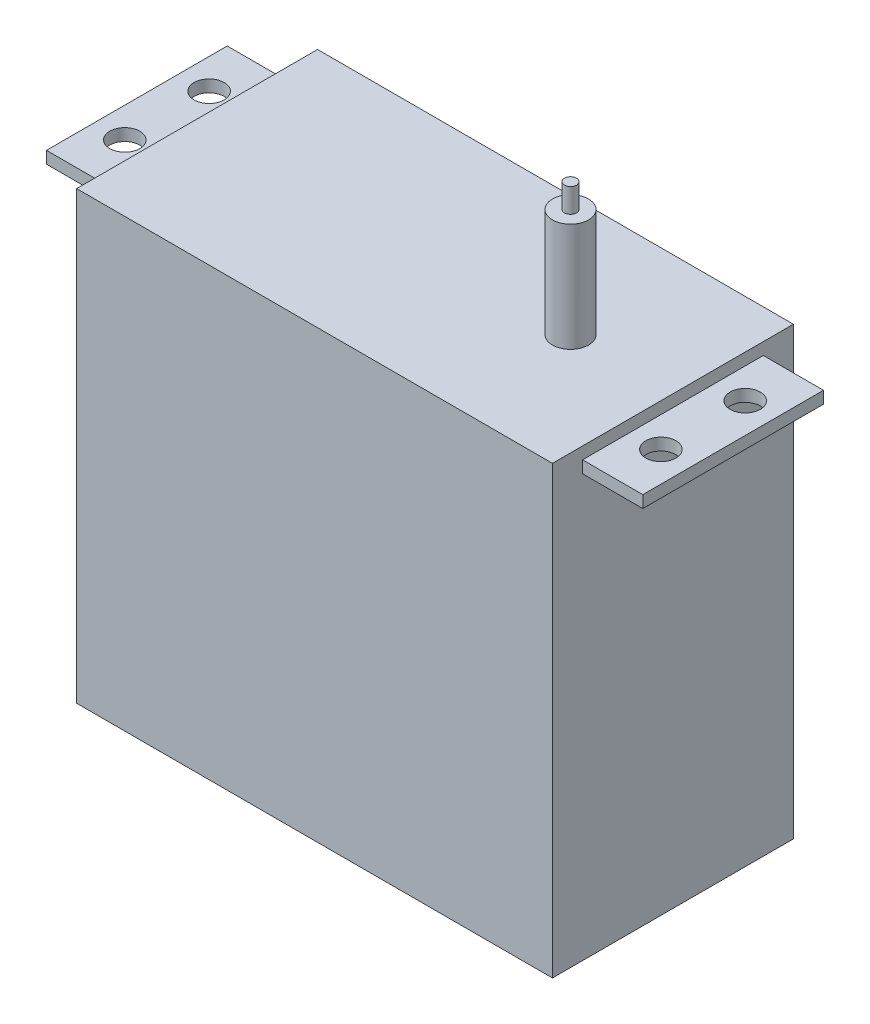
ISO-10303-21;
HEADER;
FILE_DESCRIPTION(('STEP AP214'),'2;1');
FILE_NAME('part.step','',(''),(''),'','','');
FILE_SCHEMA(('AUTOMOTIVE_DESIGN { 1 0 10303 214 1 1 1 1 }'));
ENDSEC;
DATA;
#1=APPLICATION_CONTEXT('core data for automotive mechanical design processes');
#2=APPLICATION_PROTOCOL_DEFINITION('international standard','automotive_design',2000,#1);
#3=PRODUCT_CONTEXT('',#1,'mechanical');
#4=PRODUCT('Part','Part','',(#3));
#5=PRODUCT_RELATED_PRODUCT_CATEGORY('part','',(#4));
#6=PRODUCT_DEFINITION_FORMATION('','',#4);
#7=PRODUCT_DEFINITION_CONTEXT('part definition',#1,'design');
#8=PRODUCT_DEFINITION('design','',#6,#7);
#9=PRODUCT_DEFINITION_SHAPE('','',#8);
#10=(LENGTH_UNIT() NAMED_UNIT(*) SI_UNIT(.MILLI.,.METRE.));
#11=(NAMED_UNIT(*) PLANE_ANGLE_UNIT() SI_UNIT($,.RADIAN.));
#12=(NAMED_UNIT(*) SI_UNIT($,.STERADIAN.) SOLID_ANGLE_UNIT());
#13=UNCERTAINTY_MEASURE_WITH_UNIT(LENGTH_MEASURE(1.E-05),#10,'distance_accuracy_value','');
#14=(GEOMETRIC_REPRESENTATION_CONTEXT(3) GLOBAL_UNCERTAINTY_ASSIGNED_CONTEXT((#13)) GLOBAL_UNIT_ASSIGNED_CONTEXT((#10,
#11,#12)) REPRESENTATION_CONTEXT('',''));
#15=CARTESIAN_POINT('',(0.,0.,0.));
#16=DIRECTION('',(0.,0.,1.));
#17=DIRECTION('',(1.,0.,0.));
#18=AXIS2_PLACEMENT_3D('',#15,#16,#17);
#19=CARTESIAN_POINT('',(0.,37.,0.));
#20=DIRECTION('',(1.,0.,0.));
#21=DIRECTION('',(0.,0.,-1.));
#22=AXIS2_PLACEMENT_3D('',#19,#20,#21);
#23=PLANE('',#22);
#24=DIRECTION('',(0.,0.,1.));
#25=VECTOR('',#24,1.);
#26=CARTESIAN_POINT('',(0.,0.,0.));
#27=LINE('',#26,#25);
#28=CARTESIAN_POINT('',(0.,0.,-20.));
#29=VERTEX_POINT('',#28);
#30=CARTESIAN_POINT('',(0.,0.,0.));
#31=VERTEX_POINT('',#30);
#32=EDGE_CURVE('E183',#29,#31,#27,.T.);
#33=ORIENTED_EDGE('',*,*,#32,.T.);
#34=DIRECTION('',(0.,-1.,0.));
#35=VECTOR('',#34,1.);
#36=CARTESIAN_POINT('',(0.,37.,0.));
#37=LINE('',#36,#35);
#38=CARTESIAN_POINT('',(0.,37.,0.));
#39=VERTEX_POINT('',#38);
#40=EDGE_CURVE('E40',#39,#31,#37,.T.);
#41=ORIENTED_EDGE('',*,*,#40,.F.);
#42=DIRECTION('',(0.,0.,1.));
#43=VECTOR('',#42,1.);
#44=CARTESIAN_POINT('',(0.,37.,0.));
#45=LINE('',#44,#43);
#46=CARTESIAN_POINT('',(0.,37.,-20.));
#47=VERTEX_POINT('',#46);
#48=EDGE_CURVE('E184',#47,#39,#45,.T.);
#49=ORIENTED_EDGE('',*,*,#48,.F.);
#50=DIRECTION('',(0.,-1.,0.));
#51=VECTOR('',#50,1.);
#52=CARTESIAN_POINT('',(0.,37.,-20.));
#53=LINE('',#52,#51);
#54=EDGE_CURVE('E194',#47,#29,#53,.T.);
#55=ORIENTED_EDGE('',*,*,#54,.T.);
#56=EDGE_LOOP('',(#33,#41,#49,#55));
#57=FACE_BOUND('',#56,.T.);
#58=DIRECTION('',(0.,-1.,0.));
#59=VECTOR('',#58,1.);
#60=CARTESIAN_POINT('',(0.,35.,-17.5));
#61=LINE('',#60,#59);
#62=CARTESIAN_POINT('',(0.,36.,-17.5));
#63=VERTEX_POINT('',#62);
#64=CARTESIAN_POINT('',(0.,35.,-17.5));
#65=VERTEX_POINT('',#64);
#66=EDGE_CURVE('E141',#63,#65,#61,.T.);
#67=ORIENTED_EDGE('',*,*,#66,.F.);
#68=DIRECTION('',(0.,0.,-1.));
#69=VECTOR('',#68,1.);
#70=CARTESIAN_POINT('',(0.,36.,-17.5));
#71=LINE('',#70,#69);
#72=CARTESIAN_POINT('',(0.,36.,-2.5));
#73=VERTEX_POINT('',#72);
#74=EDGE_CURVE('E138',#73,#63,#71,.T.);
#75=ORIENTED_EDGE('',*,*,#74,.F.);
#76=DIRECTION('',(0.,1.,0.));
#77=VECTOR('',#76,1.);
#78=CARTESIAN_POINT('',(0.,35.,-2.5));
#79=LINE('',#78,#77);
#80=CARTESIAN_POINT('',(0.,35.,-2.5));
#81=VERTEX_POINT('',#80);
#82=EDGE_CURVE('E52',#81,#73,#79,.T.);
#83=ORIENTED_EDGE('',*,*,#82,.F.);
#84=DIRECTION('',(0.,0.,1.));
#85=VECTOR('',#84,1.);
#86=CARTESIAN_POINT('',(0.,35.,-17.5));
#87=LINE('',#86,#85);
#88=EDGE_CURVE('E47',#65,#81,#87,.T.);
#89=ORIENTED_EDGE('',*,*,#88,.F.);
#90=EDGE_LOOP('',(#67,#75,#83,#89));
#91=FACE_BOUND('',#90,.T.);
#92=ADVANCED_FACE('F33',(#57,#91),#23,.F.);
#93=CARTESIAN_POINT('',(39.5,37.,0.));
#94=DIRECTION('',(-1.,0.,0.));
#95=DIRECTION('',(0.,0.,1.));
#96=AXIS2_PLACEMENT_3D('',#93,#94,#95);
#97=PLANE('',#96);
#98=DIRECTION('',(0.,0.,-1.));
#99=VECTOR('',#98,1.);
#100=CARTESIAN_POINT('',(39.5,0.,0.));
#101=LINE('',#100,#99);
#102=CARTESIAN_POINT('',(39.5,0.,0.));
#103=VERTEX_POINT('',#102);
#104=CARTESIAN_POINT('',(39.5,0.,-20.));
#105=VERTEX_POINT('',#104);
#106=EDGE_CURVE('E199',#103,#105,#101,.T.);
#107=ORIENTED_EDGE('',*,*,#106,.T.);
#108=DIRECTION('',(0.,-1.,0.));
#109=VECTOR('',#108,1.);
#110=CARTESIAN_POINT('',(39.5,37.,-20.));
#111=LINE('',#110,#109);
#112=CARTESIAN_POINT('',(39.5,37.,-20.));
#113=VERTEX_POINT('',#112);
#114=EDGE_CURVE('E204',#113,#105,#111,.T.);
#115=ORIENTED_EDGE('',*,*,#114,.F.);
#116=DIRECTION('',(0.,0.,-1.));
#117=VECTOR('',#116,1.);
#118=CARTESIAN_POINT('',(39.5,37.,0.));
#119=LINE('',#118,#117);
#120=CARTESIAN_POINT('',(39.5,37.,0.));
#121=VERTEX_POINT('',#120);
#122=EDGE_CURVE('E190',#121,#113,#119,.T.);
#123=ORIENTED_EDGE('',*,*,#122,.F.);
#124=DIRECTION('',(0.,-1.,0.));
#125=VECTOR('',#124,1.);
#126=CARTESIAN_POINT('',(39.5,37.,0.));
#127=LINE('',#126,#125);
#128=EDGE_CURVE('E207',#121,#103,#127,.T.);
#129=ORIENTED_EDGE('',*,*,#128,.T.);
#130=EDGE_LOOP('',(#107,#115,#123,#129));
#131=FACE_BOUND('',#130,.T.);
#132=DIRECTION('',(0.,1.,0.));
#133=VECTOR('',#132,1.);
#134=CARTESIAN_POINT('',(39.5,36.,-17.5));
#135=LINE('',#134,#133);
#136=CARTESIAN_POINT('',(39.5,35.,-17.5));
#137=VERTEX_POINT('',#136);
#138=CARTESIAN_POINT('',(39.5,36.,-17.5));
#139=VERTEX_POINT('',#138);
#140=EDGE_CURVE('E142',#137,#139,#135,.T.);
#141=ORIENTED_EDGE('',*,*,#140,.F.);
#142=DIRECTION('',(0.,0.,-1.));
#143=VECTOR('',#142,1.);
#144=CARTESIAN_POINT('',(39.5,35.,-17.5));
#145=LINE('',#144,#143);
#146=CARTESIAN_POINT('',(39.5,35.,-2.5));
#147=VERTEX_POINT('',#146);
#148=EDGE_CURVE('E155',#147,#137,#145,.T.);
#149=ORIENTED_EDGE('',*,*,#148,.F.);
#150=DIRECTION('',(0.,-1.,0.));
#151=VECTOR('',#150,1.);
#152=CARTESIAN_POINT('',(39.5,36.,-2.5));
#153=LINE('',#152,#151);
#154=CARTESIAN_POINT('',(39.5,36.,-2.5));
#155=VERTEX_POINT('',#154);
#156=EDGE_CURVE('E164',#155,#147,#153,.T.);
#157=ORIENTED_EDGE('',*,*,#156,.F.);
#158=DIRECTION('',(0.,0.,1.));
#159=VECTOR('',#158,1.);
#160=CARTESIAN_POINT('',(39.5,36.,-17.5));
#161=LINE('',#160,#159);
#162=EDGE_CURVE('E145',#139,#155,#161,.T.);
#163=ORIENTED_EDGE('',*,*,#162,.F.);
#164=EDGE_LOOP('',(#141,#149,#157,#163));
#165=FACE_BOUND('',#164,.T.);
#166=ADVANCED_FACE('F224',(#131,#165),#97,.F.);
#167=CARTESIAN_POINT('',(0.,37.,0.));
#168=DIRECTION('',(0.,0.,-1.));
#169=DIRECTION('',(-1.,0.,0.));
#170=AXIS2_PLACEMENT_3D('',#167,#168,#169);
#171=PLANE('',#170);
#172=DIRECTION('',(1.,0.,0.));
#173=VECTOR('',#172,1.);
#174=CARTESIAN_POINT('',(0.,0.,0.));
#175=LINE('',#174,#173);
#176=EDGE_CURVE('E197',#31,#103,#175,.T.);
#177=ORIENTED_EDGE('',*,*,#176,.T.);
#178=ORIENTED_EDGE('',*,*,#128,.F.);
#179=DIRECTION('',(1.,0.,0.));
#180=VECTOR('',#179,1.);
#181=CARTESIAN_POINT('',(0.,37.,0.));
#182=LINE('',#181,#180);
#183=EDGE_CURVE('E187',#39,#121,#182,.T.);
#184=ORIENTED_EDGE('',*,*,#183,.F.);
#185=ORIENTED_EDGE('',*,*,#40,.T.);
#186=EDGE_LOOP('',(#177,#178,#184,#185));
#187=FACE_BOUND('',#186,.T.);
#188=ADVANCED_FACE('F212',(#187),#171,.F.);
#189=CARTESIAN_POINT('',(0.,37.,-20.));
#190=DIRECTION('',(0.,0.,1.));
#191=DIRECTION('',(1.,0.,0.));
#192=AXIS2_PLACEMENT_3D('',#189,#190,#191);
#193=PLANE('',#192);
#194=DIRECTION('',(-1.,0.,0.));
#195=VECTOR('',#194,1.);
#196=CARTESIAN_POINT('',(0.,0.,-20.));
#197=LINE('',#196,#195);
#198=EDGE_CURVE('E188',#105,#29,#197,.T.);
#199=ORIENTED_EDGE('',*,*,#198,.T.);
#200=ORIENTED_EDGE('',*,*,#54,.F.);
#201=DIRECTION('',(-1.,0.,0.));
#202=VECTOR('',#201,1.);
#203=CARTESIAN_POINT('',(0.,37.,-20.));
#204=LINE('',#203,#202);
#205=EDGE_CURVE('E192',#113,#47,#204,.T.);
#206=ORIENTED_EDGE('',*,*,#205,.F.);
#207=ORIENTED_EDGE('',*,*,#114,.T.);
#208=EDGE_LOOP('',(#199,#200,#206,#207));
#209=FACE_BOUND('',#208,.T.);
#210=ADVANCED_FACE('F229',(#209),#193,.F.);
#211=CARTESIAN_POINT('',(0.,37.,0.));
#212=DIRECTION('',(0.,-1.,0.));
#213=DIRECTION('',(0.,0.,-1.));
#214=AXIS2_PLACEMENT_3D('',#211,#212,#213);
#215=PLANE('',#214);
#216=CARTESIAN_POINT('',(31.,37.,-10.));
#217=DIRECTION('',(0.,-1.,0.));
#218=DIRECTION('',(0.,0.,-1.));
#219=AXIS2_PLACEMENT_3D('',#216,#217,#218);
#220=CIRCLE('',#219,1.5);
#221=CARTESIAN_POINT('',(31.,37.,-11.5));
#222=VERTEX_POINT('',#221);
#223=EDGE_CURVE('E11',#222,#222,#220,.F.);
#224=ORIENTED_EDGE('',*,*,#223,.F.);
#225=EDGE_LOOP('',(#224));
#226=FACE_BOUND('',#225,.T.);
#227=ORIENTED_EDGE('',*,*,#48,.T.);
#228=ORIENTED_EDGE('',*,*,#183,.T.);
#229=ORIENTED_EDGE('',*,*,#122,.T.);
#230=ORIENTED_EDGE('',*,*,#205,.T.);
#231=EDGE_LOOP('',(#227,#228,#229,#230));
#232=FACE_BOUND('',#231,.T.);
#233=ADVANCED_FACE('F231',(#226,#232),#215,.F.);
#234=CARTESIAN_POINT('',(0.,0.,0.));
#235=DIRECTION('',(0.,-1.,0.));
#236=DIRECTION('',(0.,0.,-1.));
#237=AXIS2_PLACEMENT_3D('',#234,#235,#236);
#238=PLANE('',#237);
#239=ORIENTED_EDGE('',*,*,#32,.F.);
#240=ORIENTED_EDGE('',*,*,#198,.F.);
#241=ORIENTED_EDGE('',*,*,#106,.F.);
#242=ORIENTED_EDGE('',*,*,#176,.F.);
#243=EDGE_LOOP('',(#239,#240,#241,#242));
#244=FACE_BOUND('',#243,.T.);
#245=ADVANCED_FACE('F220',(#244),#238,.T.);
#246=CARTESIAN_POINT('',(31.,46.,-10.));
#247=DIRECTION('',(0.,-1.,0.));
#248=DIRECTION('',(0.,0.,-1.));
#249=AXIS2_PLACEMENT_3D('',#246,#247,#248);
#250=CYLINDRICAL_SURFACE('',#249,1.5);
#251=CARTESIAN_POINT('',(31.,46.,-10.));
#252=DIRECTION('',(0.,1.,0.));
#253=DIRECTION('',(0.,0.,1.));
#254=AXIS2_PLACEMENT_3D('',#251,#252,#253);
#255=CIRCLE('',#254,1.5);
#256=CARTESIAN_POINT('',(31.,46.,-8.49999999999999));
#257=VERTEX_POINT('',#256);
#258=EDGE_CURVE('E180',#257,#257,#255,.T.);
#259=ORIENTED_EDGE('',*,*,#258,.F.);
#260=EDGE_LOOP('',(#259));
#261=FACE_BOUND('',#260,.T.);
#262=ORIENTED_EDGE('',*,*,#223,.T.);
#263=EDGE_LOOP('',(#262));
#264=FACE_BOUND('',#263,.T.);
#265=ADVANCED_FACE('F239',(#261,#264),#250,.T.);
#266=CARTESIAN_POINT('',(31.,46.,-10.));
#267=DIRECTION('',(0.,1.,0.));
#268=DIRECTION('',(0.,0.,1.));
#269=AXIS2_PLACEMENT_3D('',#266,#267,#268);
#270=PLANE('',#269);
#271=CARTESIAN_POINT('',(31.,46.,-10.));
#272=DIRECTION('',(0.,1.,0.));
#273=DIRECTION('',(0.,0.,1.));
#274=AXIS2_PLACEMENT_3D('',#271,#272,#273);
#275=CIRCLE('',#274,0.499999999999999);
#276=CARTESIAN_POINT('',(31.,46.,-9.5));
#277=VERTEX_POINT('',#276);
#278=EDGE_CURVE('E457',#277,#277,#275,.T.);
#279=ORIENTED_EDGE('',*,*,#278,.F.);
#280=EDGE_LOOP('',(#279));
#281=FACE_BOUND('',#280,.T.);
#282=ORIENTED_EDGE('',*,*,#258,.T.);
#283=EDGE_LOOP('',(#282));
#284=FACE_BOUND('',#283,.T.);
#285=ADVANCED_FACE('F276',(#281,#284),#270,.T.);
#286=CARTESIAN_POINT('',(44.5,36.,-17.5));
#287=DIRECTION('',(0.,0.,1.));
#288=DIRECTION('',(1.,0.,0.));
#289=AXIS2_PLACEMENT_3D('',#286,#287,#288);
#290=PLANE('',#289);
#291=ORIENTED_EDGE('',*,*,#140,.T.);
#292=DIRECTION('',(-1.,0.,0.));
#293=VECTOR('',#292,1.);
#294=CARTESIAN_POINT('',(44.5,36.,-17.5));
#295=LINE('',#294,#293);
#296=CARTESIAN_POINT('',(44.5,36.,-17.5));
#297=VERTEX_POINT('',#296);
#298=EDGE_CURVE('E177',#297,#139,#295,.T.);
#299=ORIENTED_EDGE('',*,*,#298,.F.);
#300=DIRECTION('',(0.,1.,0.));
#301=VECTOR('',#300,1.);
#302=CARTESIAN_POINT('',(44.5,36.,-17.5));
#303=LINE('',#302,#301);
#304=CARTESIAN_POINT('',(44.5,35.,-17.5));
#305=VERTEX_POINT('',#304);
#306=EDGE_CURVE('E151',#305,#297,#303,.T.);
#307=ORIENTED_EDGE('',*,*,#306,.F.);
#308=DIRECTION('',(-1.,0.,0.));
#309=VECTOR('',#308,1.);
#310=CARTESIAN_POINT('',(44.5,35.,-17.5));
#311=LINE('',#310,#309);
#312=EDGE_CURVE('E160',#305,#137,#311,.T.);
#313=ORIENTED_EDGE('',*,*,#312,.T.);
#314=EDGE_LOOP('',(#291,#299,#307,#313));
#315=FACE_BOUND('',#314,.T.);
#316=ADVANCED_FACE('F289',(#315),#290,.F.);
#317=CARTESIAN_POINT('',(44.5,36.,-17.5));
#318=DIRECTION('',(0.,-1.,0.));
#319=DIRECTION('',(0.,0.,-1.));
#320=AXIS2_PLACEMENT_3D('',#317,#318,#319);
#321=PLANE('',#320);
#322=CARTESIAN_POINT('',(42.,36.,-6.5));
#323=DIRECTION('',(0.,1.,0.));
#324=DIRECTION('',(0.,0.,1.));
#325=AXIS2_PLACEMENT_3D('',#322,#323,#324);
#326=CIRCLE('',#325,1.24999999999999);
#327=CARTESIAN_POINT('',(42.,36.,-5.25000000000002));
#328=VERTEX_POINT('',#327);
#329=EDGE_CURVE('E473',#328,#328,#326,.T.);
#330=ORIENTED_EDGE('',*,*,#329,.F.);
#331=EDGE_LOOP('',(#330));
#332=FACE_BOUND('',#331,.T.);
#333=CARTESIAN_POINT('',(42.,36.,-13.5));
#334=DIRECTION('',(0.,1.,0.));
#335=DIRECTION('',(0.,0.,1.));
#336=AXIS2_PLACEMENT_3D('',#333,#334,#335);
#337=CIRCLE('',#336,1.24999999999999);
#338=CARTESIAN_POINT('',(42.,36.,-12.25));
#339=VERTEX_POINT('',#338);
#340=EDGE_CURVE('E479',#339,#339,#337,.T.);
#341=ORIENTED_EDGE('',*,*,#340,.F.);
#342=EDGE_LOOP('',(#341));
#343=FACE_BOUND('',#342,.T.);
#344=ORIENTED_EDGE('',*,*,#162,.T.);
#345=DIRECTION('',(-1.,0.,0.));
#346=VECTOR('',#345,1.);
#347=CARTESIAN_POINT('',(44.5,36.,-2.5));
#348=LINE('',#347,#346);
#349=CARTESIAN_POINT('',(44.5,36.,-2.5));
#350=VERTEX_POINT('',#349);
#351=EDGE_CURVE('E174',#350,#155,#348,.T.);
#352=ORIENTED_EDGE('',*,*,#351,.F.);
#353=DIRECTION('',(0.,0.,1.));
#354=VECTOR('',#353,1.);
#355=CARTESIAN_POINT('',(44.5,36.,-17.5));
#356=LINE('',#355,#354);
#357=EDGE_CURVE('E154',#297,#350,#356,.T.);
#358=ORIENTED_EDGE('',*,*,#357,.F.);
#359=ORIENTED_EDGE('',*,*,#298,.T.);
#360=EDGE_LOOP('',(#344,#352,#358,#359));
#361=FACE_BOUND('',#360,.T.);
#362=ADVANCED_FACE('F293',(#332,#343,#361),#321,.F.);
#363=CARTESIAN_POINT('',(44.5,36.,-2.5));
#364=DIRECTION('',(0.,0.,-1.));
#365=DIRECTION('',(0.,1.,0.));
#366=AXIS2_PLACEMENT_3D('',#363,#364,#365);
#367=PLANE('',#366);
#368=ORIENTED_EDGE('',*,*,#156,.T.);
#369=DIRECTION('',(-1.,0.,0.));
#370=VECTOR('',#369,1.);
#371=CARTESIAN_POINT('',(44.5,35.,-2.5));
#372=LINE('',#371,#370);
#373=CARTESIAN_POINT('',(44.5,35.,-2.5));
#374=VERTEX_POINT('',#373);
#375=EDGE_CURVE('E171',#374,#147,#372,.T.);
#376=ORIENTED_EDGE('',*,*,#375,.F.);
#377=DIRECTION('',(0.,-1.,0.));
#378=VECTOR('',#377,1.);
#379=CARTESIAN_POINT('',(44.5,36.,-2.5));
#380=LINE('',#379,#378);
#381=EDGE_CURVE('E157',#350,#374,#380,.T.);
#382=ORIENTED_EDGE('',*,*,#381,.F.);
#383=ORIENTED_EDGE('',*,*,#351,.T.);
#384=EDGE_LOOP('',(#368,#376,#382,#383));
#385=FACE_BOUND('',#384,.T.);
#386=ADVANCED_FACE('F301',(#385),#367,.F.);
#387=CARTESIAN_POINT('',(44.5,35.,-17.5));
#388=DIRECTION('',(0.,1.,0.));
#389=DIRECTION('',(0.,0.,1.));
#390=AXIS2_PLACEMENT_3D('',#387,#388,#389);
#391=PLANE('',#390);
#392=CARTESIAN_POINT('',(42.,35.,-6.5));
#393=DIRECTION('',(0.,1.,0.));
#394=DIRECTION('',(0.,0.,1.));
#395=AXIS2_PLACEMENT_3D('',#392,#393,#394);
#396=CIRCLE('',#395,1.24999999999999);
#397=CARTESIAN_POINT('',(42.,35.,-5.25000000000002));
#398=VERTEX_POINT('',#397);
#399=EDGE_CURVE('E476',#398,#398,#396,.T.);
#400=ORIENTED_EDGE('',*,*,#399,.T.);
#401=EDGE_LOOP('',(#400));
#402=FACE_BOUND('',#401,.T.);
#403=CARTESIAN_POINT('',(42.,35.,-13.5));
#404=DIRECTION('',(0.,1.,0.));
#405=DIRECTION('',(0.,0.,1.));
#406=AXIS2_PLACEMENT_3D('',#403,#404,#405);
#407=CIRCLE('',#406,1.24999999999999);
#408=CARTESIAN_POINT('',(42.,35.,-12.25));
#409=VERTEX_POINT('',#408);
#410=EDGE_CURVE('E482',#409,#409,#407,.T.);
#411=ORIENTED_EDGE('',*,*,#410,.T.);
#412=EDGE_LOOP('',(#411));
#413=FACE_BOUND('',#412,.T.);
#414=ORIENTED_EDGE('',*,*,#148,.T.);
#415=ORIENTED_EDGE('',*,*,#312,.F.);
#416=DIRECTION('',(0.,0.,-1.));
#417=VECTOR('',#416,1.);
#418=CARTESIAN_POINT('',(44.5,35.,-17.5));
#419=LINE('',#418,#417);
#420=EDGE_CURVE('E159',#374,#305,#419,.T.);
#421=ORIENTED_EDGE('',*,*,#420,.F.);
#422=ORIENTED_EDGE('',*,*,#375,.T.);
#423=EDGE_LOOP('',(#414,#415,#421,#422));
#424=FACE_BOUND('',#423,.T.);
#425=ADVANCED_FACE('F306',(#402,#413,#424),#391,.F.);
#426=CARTESIAN_POINT('',(44.5,0.,0.));
#427=DIRECTION('',(-1.,0.,0.));
#428=DIRECTION('',(0.,0.,1.));
#429=AXIS2_PLACEMENT_3D('',#426,#427,#428);
#430=PLANE('',#429);
#431=ORIENTED_EDGE('',*,*,#306,.T.);
#432=ORIENTED_EDGE('',*,*,#357,.T.);
#433=ORIENTED_EDGE('',*,*,#381,.T.);
#434=ORIENTED_EDGE('',*,*,#420,.T.);
#435=EDGE_LOOP('',(#431,#432,#433,#434));
#436=FACE_BOUND('',#435,.T.);
#437=ADVANCED_FACE('F314',(#436),#430,.F.);
#438=CARTESIAN_POINT('',(-5.,35.,-17.5));
#439=DIRECTION('',(0.,0.,1.));
#440=DIRECTION('',(0.,-1.,0.));
#441=AXIS2_PLACEMENT_3D('',#438,#439,#440);
#442=PLANE('',#441);
#443=ORIENTED_EDGE('',*,*,#66,.T.);
#444=DIRECTION('',(1.,0.,0.));
#445=VECTOR('',#444,1.);
#446=CARTESIAN_POINT('',(-5.,35.,-17.5));
#447=LINE('',#446,#445);
#448=CARTESIAN_POINT('',(-5.,35.,-17.5));
#449=VERTEX_POINT('',#448);
#450=EDGE_CURVE('E122',#449,#65,#447,.T.);
#451=ORIENTED_EDGE('',*,*,#450,.F.);
#452=DIRECTION('',(0.,-1.,0.));
#453=VECTOR('',#452,1.);
#454=CARTESIAN_POINT('',(-5.,35.,-17.5));
#455=LINE('',#454,#453);
#456=CARTESIAN_POINT('',(-5.,36.,-17.5));
#457=VERTEX_POINT('',#456);
#458=EDGE_CURVE('E129',#457,#449,#455,.T.);
#459=ORIENTED_EDGE('',*,*,#458,.F.);
#460=DIRECTION('',(1.,0.,0.));
#461=VECTOR('',#460,1.);
#462=CARTESIAN_POINT('',(-5.,36.,-17.5));
#463=LINE('',#462,#461);
#464=EDGE_CURVE('E487',#457,#63,#463,.T.);
#465=ORIENTED_EDGE('',*,*,#464,.T.);
#466=EDGE_LOOP('',(#443,#451,#459,#465));
#467=FACE_BOUND('',#466,.T.);
#468=ADVANCED_FACE('F140',(#467),#442,.F.);
#469=CARTESIAN_POINT('',(-5.,35.,-17.5));
#470=DIRECTION('',(0.,1.,0.));
#471=DIRECTION('',(0.,0.,1.));
#472=AXIS2_PLACEMENT_3D('',#469,#470,#471);
#473=PLANE('',#472);
#474=CARTESIAN_POINT('',(-2.5,35.,-13.5));
#475=DIRECTION('',(0.,1.,0.));
#476=DIRECTION('',(0.,0.,1.));
#477=AXIS2_PLACEMENT_3D('',#474,#475,#476);
#478=CIRCLE('',#477,1.24999999999999);
#479=CARTESIAN_POINT('',(-2.5,35.,-12.25));
#480=VERTEX_POINT('',#479);
#481=EDGE_CURVE('E460',#480,#480,#478,.T.);
#482=ORIENTED_EDGE('',*,*,#481,.T.);
#483=EDGE_LOOP('',(#482));
#484=FACE_BOUND('',#483,.T.);
#485=CARTESIAN_POINT('',(-2.5,35.,-6.5));
#486=DIRECTION('',(0.,1.,0.));
#487=DIRECTION('',(0.,0.,1.));
#488=AXIS2_PLACEMENT_3D('',#485,#486,#487);
#489=CIRCLE('',#488,1.24999999999999);
#490=CARTESIAN_POINT('',(-2.5,35.,-5.25000000000001));
#491=VERTEX_POINT('',#490);
#492=EDGE_CURVE('E470',#491,#491,#489,.T.);
#493=ORIENTED_EDGE('',*,*,#492,.T.);
#494=EDGE_LOOP('',(#493));
#495=FACE_BOUND('',#494,.T.);
#496=ORIENTED_EDGE('',*,*,#88,.T.);
#497=DIRECTION('',(1.,0.,0.));
#498=VECTOR('',#497,1.);
#499=CARTESIAN_POINT('',(-5.,35.,-2.5));
#500=LINE('',#499,#498);
#501=CARTESIAN_POINT('',(-5.,35.,-2.5));
#502=VERTEX_POINT('',#501);
#503=EDGE_CURVE('E125',#502,#81,#500,.T.);
#504=ORIENTED_EDGE('',*,*,#503,.F.);
#505=DIRECTION('',(0.,0.,1.));
#506=VECTOR('',#505,1.);
#507=CARTESIAN_POINT('',(-5.,35.,-17.5));
#508=LINE('',#507,#506);
#509=EDGE_CURVE('E118',#449,#502,#508,.T.);
#510=ORIENTED_EDGE('',*,*,#509,.F.);
#511=ORIENTED_EDGE('',*,*,#450,.T.);
#512=EDGE_LOOP('',(#496,#504,#510,#511));
#513=FACE_BOUND('',#512,.T.);
#514=ADVANCED_FACE('F120',(#484,#495,#513),#473,.F.);
#515=CARTESIAN_POINT('',(-5.,35.,-2.5));
#516=DIRECTION('',(0.,0.,-1.));
#517=DIRECTION('',(-1.,0.,0.));
#518=AXIS2_PLACEMENT_3D('',#515,#516,#517);
#519=PLANE('',#518);
#520=ORIENTED_EDGE('',*,*,#82,.T.);
#521=DIRECTION('',(1.,0.,0.));
#522=VECTOR('',#521,1.);
#523=CARTESIAN_POINT('',(-5.,36.,-2.5));
#524=LINE('',#523,#522);
#525=CARTESIAN_POINT('',(-5.,36.,-2.5));
#526=VERTEX_POINT('',#525);
#527=EDGE_CURVE('E147',#526,#73,#524,.T.);
#528=ORIENTED_EDGE('',*,*,#527,.F.);
#529=DIRECTION('',(0.,1.,0.));
#530=VECTOR('',#529,1.);
#531=CARTESIAN_POINT('',(-5.,35.,-2.5));
#532=LINE('',#531,#530);
#533=EDGE_CURVE('E128',#502,#526,#532,.T.);
#534=ORIENTED_EDGE('',*,*,#533,.F.);
#535=ORIENTED_EDGE('',*,*,#503,.T.);
#536=EDGE_LOOP('',(#520,#528,#534,#535));
#537=FACE_BOUND('',#536,.T.);
#538=ADVANCED_FACE('F338',(#537),#519,.F.);
#539=CARTESIAN_POINT('',(-5.,36.,-17.5));
#540=DIRECTION('',(0.,-1.,0.));
#541=DIRECTION('',(0.,0.,-1.));
#542=AXIS2_PLACEMENT_3D('',#539,#540,#541);
#543=PLANE('',#542);
#544=CARTESIAN_POINT('',(-2.5,36.,-13.5));
#545=DIRECTION('',(0.,1.,0.));
#546=DIRECTION('',(0.,0.,1.));
#547=AXIS2_PLACEMENT_3D('',#544,#545,#546);
#548=CIRCLE('',#547,1.24999999999999);
#549=CARTESIAN_POINT('',(-2.5,36.,-12.25));
#550=VERTEX_POINT('',#549);
#551=EDGE_CURVE('E456',#550,#550,#548,.T.);
#552=ORIENTED_EDGE('',*,*,#551,.F.);
#553=EDGE_LOOP('',(#552));
#554=FACE_BOUND('',#553,.T.);
#555=CARTESIAN_POINT('',(-2.5,36.,-6.5));
#556=DIRECTION('',(0.,1.,0.));
#557=DIRECTION('',(0.,0.,1.));
#558=AXIS2_PLACEMENT_3D('',#555,#556,#557);
#559=CIRCLE('',#558,1.24999999999999);
#560=CARTESIAN_POINT('',(-2.5,36.,-5.25000000000001));
#561=VERTEX_POINT('',#560);
#562=EDGE_CURVE('E467',#561,#561,#559,.T.);
#563=ORIENTED_EDGE('',*,*,#562,.F.);
#564=EDGE_LOOP('',(#563));
#565=FACE_BOUND('',#564,.T.);
#566=ORIENTED_EDGE('',*,*,#74,.T.);
#567=ORIENTED_EDGE('',*,*,#464,.F.);
#568=DIRECTION('',(0.,0.,-1.));
#569=VECTOR('',#568,1.);
#570=CARTESIAN_POINT('',(-5.,36.,-17.5));
#571=LINE('',#570,#569);
#572=EDGE_CURVE('E134',#526,#457,#571,.T.);
#573=ORIENTED_EDGE('',*,*,#572,.F.);
#574=ORIENTED_EDGE('',*,*,#527,.T.);
#575=EDGE_LOOP('',(#566,#567,#573,#574));
#576=FACE_BOUND('',#575,.T.);
#577=ADVANCED_FACE('F343',(#554,#565,#576),#543,.F.);
#578=CARTESIAN_POINT('',(-5.,0.,0.));
#579=DIRECTION('',(1.,0.,0.));
#580=DIRECTION('',(0.,0.,-1.));
#581=AXIS2_PLACEMENT_3D('',#578,#579,#580);
#582=PLANE('',#581);
#583=ORIENTED_EDGE('',*,*,#458,.T.);
#584=ORIENTED_EDGE('',*,*,#509,.T.);
#585=ORIENTED_EDGE('',*,*,#533,.T.);
#586=ORIENTED_EDGE('',*,*,#572,.T.);
#587=EDGE_LOOP('',(#583,#584,#585,#586));
#588=FACE_BOUND('',#587,.T.);
#589=ADVANCED_FACE('F132',(#588),#582,.F.);
#590=CARTESIAN_POINT('',(42.,36.,-13.5));
#591=DIRECTION('',(0.,1.,0.));
#592=DIRECTION('',(0.,0.,1.));
#593=AXIS2_PLACEMENT_3D('',#590,#591,#592);
#594=CYLINDRICAL_SURFACE('',#593,1.24999999999999);
#595=ORIENTED_EDGE('',*,*,#340,.T.);
#596=EDGE_LOOP('',(#595));
#597=FACE_BOUND('',#596,.T.);
#598=ORIENTED_EDGE('',*,*,#410,.F.);
#599=EDGE_LOOP('',(#598));
#600=FACE_BOUND('',#599,.T.);
#601=ADVANCED_FACE('F355',(#597,#600),#594,.F.);
#602=CARTESIAN_POINT('',(42.,36.,-6.5));
#603=DIRECTION('',(0.,1.,0.));
#604=DIRECTION('',(0.,0.,1.));
#605=AXIS2_PLACEMENT_3D('',#602,#603,#604);
#606=CYLINDRICAL_SURFACE('',#605,1.24999999999999);
#607=ORIENTED_EDGE('',*,*,#329,.T.);
#608=EDGE_LOOP('',(#607));
#609=FACE_BOUND('',#608,.T.);
#610=ORIENTED_EDGE('',*,*,#399,.F.);
#611=EDGE_LOOP('',(#610));
#612=FACE_BOUND('',#611,.T.);
#613=ADVANCED_FACE('F392',(#609,#612),#606,.F.);
#614=CARTESIAN_POINT('',(-2.5,36.,-6.5));
#615=DIRECTION('',(0.,1.,0.));
#616=DIRECTION('',(0.,0.,1.));
#617=AXIS2_PLACEMENT_3D('',#614,#615,#616);
#618=CYLINDRICAL_SURFACE('',#617,1.24999999999999);
#619=ORIENTED_EDGE('',*,*,#562,.T.);
#620=EDGE_LOOP('',(#619));
#621=FACE_BOUND('',#620,.T.);
#622=ORIENTED_EDGE('',*,*,#492,.F.);
#623=EDGE_LOOP('',(#622));
#624=FACE_BOUND('',#623,.T.);
#625=ADVANCED_FACE('F402',(#621,#624),#618,.F.);
#626=CARTESIAN_POINT('',(-2.5,36.,-13.5));
#627=DIRECTION('',(0.,1.,0.));
#628=DIRECTION('',(0.,0.,1.));
#629=AXIS2_PLACEMENT_3D('',#626,#627,#628);
#630=CYLINDRICAL_SURFACE('',#629,1.24999999999999);
#631=ORIENTED_EDGE('',*,*,#551,.T.);
#632=EDGE_LOOP('',(#631));
#633=FACE_BOUND('',#632,.T.);
#634=ORIENTED_EDGE('',*,*,#481,.F.);
#635=EDGE_LOOP('',(#634));
#636=FACE_BOUND('',#635,.T.);
#637=ADVANCED_FACE('F412',(#633,#636),#630,.F.);
#638=CARTESIAN_POINT('',(31.,48.,-10.));
#639=DIRECTION('',(0.,-1.,0.));
#640=DIRECTION('',(0.,0.,-1.));
#641=AXIS2_PLACEMENT_3D('',#638,#639,#640);
#642=CYLINDRICAL_SURFACE('',#641,0.499999999999999);
#643=CARTESIAN_POINT('',(31.,48.,-10.));
#644=DIRECTION('',(0.,1.,0.));
#645=DIRECTION('',(0.,0.,1.));
#646=AXIS2_PLACEMENT_3D('',#643,#644,#645);
#647=CIRCLE('',#646,0.499999999999999);
#648=CARTESIAN_POINT('',(31.,48.,-9.5));
#649=VERTEX_POINT('',#648);
#650=EDGE_CURVE('E455',#649,#649,#647,.T.);
#651=ORIENTED_EDGE('',*,*,#650,.F.);
#652=EDGE_LOOP('',(#651));
#653=FACE_BOUND('',#652,.T.);
#654=ORIENTED_EDGE('',*,*,#278,.T.);
#655=EDGE_LOOP('',(#654));
#656=FACE_BOUND('',#655,.T.);
#657=ADVANCED_FACE('F422',(#653,#656),#642,.T.);
#658=CARTESIAN_POINT('',(31.,48.,-10.));
#659=DIRECTION('',(0.,1.,0.));
#660=DIRECTION('',(0.,0.,1.));
#661=AXIS2_PLACEMENT_3D('',#658,#659,#660);
#662=PLANE('',#661);
#663=ORIENTED_EDGE('',*,*,#650,.T.);
#664=EDGE_LOOP('',(#663));
#665=FACE_BOUND('',#664,.T.);
#666=ADVANCED_FACE('F439',(#665),#662,.T.);
#667=CLOSED_SHELL('',(#92,#166,#188,#210,#233,#245,#265,#285,#316,#362,#386,#425,#437,#468,#514,
#538,#577,#589,#601,#613,#625,#637,#657,#666));
#668=MANIFOLD_SOLID_BREP('B2',#667);
#669=ADVANCED_BREP_SHAPE_REPRESENTATION('',(#18,#668),#14);
#670=SHAPE_DEFINITION_REPRESENTATION(#9,#669);
ENDSEC;
END-ISO-10303-21;
